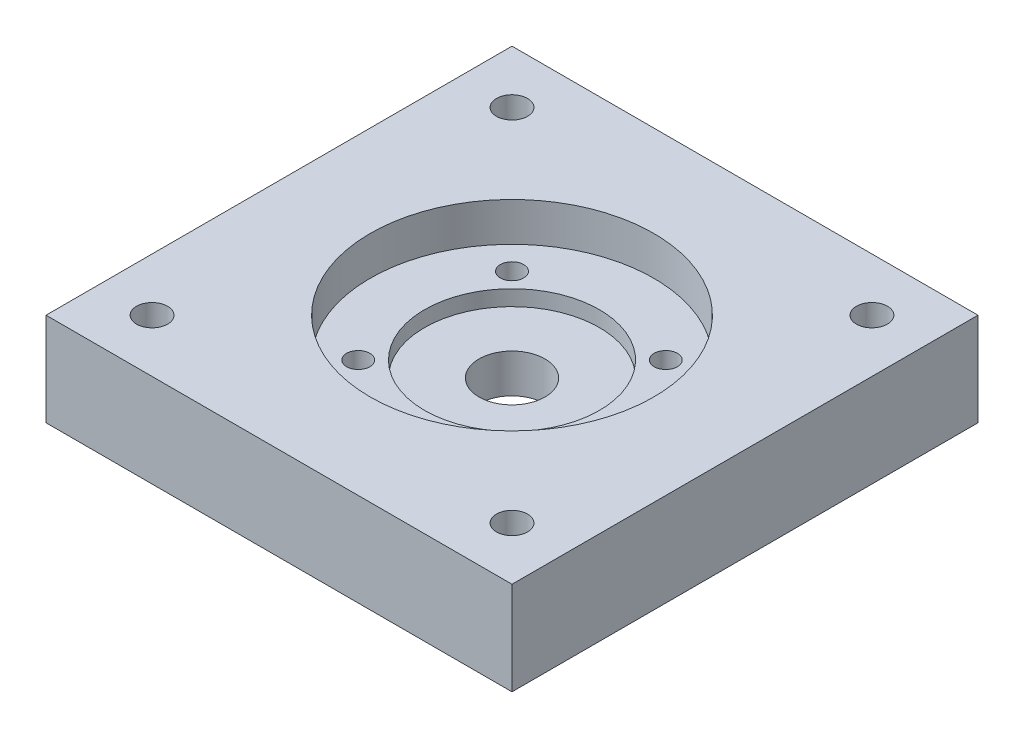
ISO-10303-21;
HEADER;
FILE_DESCRIPTION(('STEP AP214'),'2;1');
FILE_NAME('part.step','',(''),(''),'','','');
FILE_SCHEMA(('AUTOMOTIVE_DESIGN { 1 0 10303 214 1 1 1 1 }'));
ENDSEC;
DATA;
#1=APPLICATION_CONTEXT('core data for automotive mechanical design processes');
#2=APPLICATION_PROTOCOL_DEFINITION('international standard','automotive_design',2000,#1);
#3=PRODUCT_CONTEXT('',#1,'mechanical');
#4=PRODUCT('Part','Part','',(#3));
#5=PRODUCT_RELATED_PRODUCT_CATEGORY('part','',(#4));
#6=PRODUCT_DEFINITION_FORMATION('','',#4);
#7=PRODUCT_DEFINITION_CONTEXT('part definition',#1,'design');
#8=PRODUCT_DEFINITION('design','',#6,#7);
#9=PRODUCT_DEFINITION_SHAPE('','',#8);
#10=(LENGTH_UNIT() NAMED_UNIT(*) SI_UNIT(.MILLI.,.METRE.));
#11=(NAMED_UNIT(*) PLANE_ANGLE_UNIT() SI_UNIT($,.RADIAN.));
#12=(NAMED_UNIT(*) SI_UNIT($,.STERADIAN.) SOLID_ANGLE_UNIT());
#13=UNCERTAINTY_MEASURE_WITH_UNIT(LENGTH_MEASURE(1.E-05),#10,'distance_accuracy_value','');
#14=(GEOMETRIC_REPRESENTATION_CONTEXT(3) GLOBAL_UNCERTAINTY_ASSIGNED_CONTEXT((#13)) GLOBAL_UNIT_ASSIGNED_CONTEXT((#10,
#11,#12)) REPRESENTATION_CONTEXT('',''));
#15=CARTESIAN_POINT('',(0.,0.,0.));
#16=DIRECTION('',(0.,0.,1.));
#17=DIRECTION('',(1.,0.,0.));
#18=AXIS2_PLACEMENT_3D('',#15,#16,#17);
#19=CARTESIAN_POINT('',(0.,7.,0.));
#20=DIRECTION('',(0.,1.,0.));
#21=DIRECTION('',(0.,0.,1.));
#22=AXIS2_PLACEMENT_3D('',#19,#20,#21);
#23=PLANE('',#22);
#24=CARTESIAN_POINT('',(0.,7.,0.));
#25=DIRECTION('',(0.,1.,0.));
#26=DIRECTION('',(0.,0.,1.));
#27=AXIS2_PLACEMENT_3D('',#24,#25,#26);
#28=CIRCLE('',#27,11.25);
#29=CARTESIAN_POINT('',(0.,7.,11.25));
#30=VERTEX_POINT('',#29);
#31=EDGE_CURVE('E664',#30,#30,#28,.T.);
#32=ORIENTED_EDGE('',*,*,#31,.F.);
#33=EDGE_LOOP('',(#32));
#34=FACE_BOUND('',#33,.T.);
#35=CARTESIAN_POINT('',(-9.89949493661167,7.,-9.89949493661166));
#36=DIRECTION('',(0.,1.,0.));
#37=DIRECTION('',(0.,0.,1.));
#38=AXIS2_PLACEMENT_3D('',#35,#36,#37);
#39=CIRCLE('',#38,1.5);
#40=CARTESIAN_POINT('',(-9.89949493661167,7.,-8.39949493661166));
#41=VERTEX_POINT('',#40);
#42=EDGE_CURVE('E661',#41,#41,#39,.F.);
#43=ORIENTED_EDGE('',*,*,#42,.T.);
#44=EDGE_LOOP('',(#43));
#45=FACE_BOUND('',#44,.T.);
#46=CARTESIAN_POINT('',(-9.89949493661167,7.,9.89949493661166));
#47=DIRECTION('',(0.,1.,0.));
#48=DIRECTION('',(0.,0.,1.));
#49=AXIS2_PLACEMENT_3D('',#46,#47,#48);
#50=CIRCLE('',#49,1.5);
#51=CARTESIAN_POINT('',(-9.89949493661167,7.,11.3994949366117));
#52=VERTEX_POINT('',#51);
#53=EDGE_CURVE('E658',#52,#52,#50,.F.);
#54=ORIENTED_EDGE('',*,*,#53,.T.);
#55=EDGE_LOOP('',(#54));
#56=FACE_BOUND('',#55,.T.);
#57=CARTESIAN_POINT('',(9.89949493661167,7.,9.89949493661166));
#58=DIRECTION('',(0.,1.,0.));
#59=DIRECTION('',(0.,0.,1.));
#60=AXIS2_PLACEMENT_3D('',#57,#58,#59);
#61=CIRCLE('',#60,1.5);
#62=CARTESIAN_POINT('',(9.89949493661167,7.,11.3994949366117));
#63=VERTEX_POINT('',#62);
#64=EDGE_CURVE('E655',#63,#63,#61,.F.);
#65=ORIENTED_EDGE('',*,*,#64,.T.);
#66=EDGE_LOOP('',(#65));
#67=FACE_BOUND('',#66,.T.);
#68=CARTESIAN_POINT('',(9.89949493661166,7.,-9.89949493661167));
#69=DIRECTION('',(0.,1.,0.));
#70=DIRECTION('',(0.,0.,1.));
#71=AXIS2_PLACEMENT_3D('',#68,#69,#70);
#72=CIRCLE('',#71,1.5);
#73=CARTESIAN_POINT('',(9.89949493661166,7.,-8.39949493661167));
#74=VERTEX_POINT('',#73);
#75=EDGE_CURVE('E652',#74,#74,#72,.F.);
#76=ORIENTED_EDGE('',*,*,#75,.T.);
#77=EDGE_LOOP('',(#76));
#78=FACE_BOUND('',#77,.T.);
#79=CARTESIAN_POINT('',(0.,7.,0.));
#80=DIRECTION('',(0.,1.,0.));
#81=DIRECTION('',(0.,0.,1.));
#82=AXIS2_PLACEMENT_3D('',#79,#80,#81);
#83=CIRCLE('',#82,18.25);
#84=CARTESIAN_POINT('',(0.,7.,18.25));
#85=VERTEX_POINT('',#84);
#86=EDGE_CURVE('E629',#85,#85,#83,.T.);
#87=ORIENTED_EDGE('',*,*,#86,.T.);
#88=EDGE_LOOP('',(#87));
#89=FACE_BOUND('',#88,.T.);
#90=ADVANCED_FACE('F567',(#34,#45,#56,#67,#78,#89),#23,.T.);
#91=CARTESIAN_POINT('',(0.,5.,0.));
#92=DIRECTION('',(0.,1.,0.));
#93=DIRECTION('',(0.,0.,1.));
#94=AXIS2_PLACEMENT_3D('',#91,#92,#93);
#95=PLANE('',#94);
#96=CARTESIAN_POINT('',(0.,5.,0.));
#97=DIRECTION('',(0.,1.,0.));
#98=DIRECTION('',(0.,0.,1.));
#99=AXIS2_PLACEMENT_3D('',#96,#97,#98);
#100=CIRCLE('',#99,4.25);
#101=CARTESIAN_POINT('',(0.,5.,4.25));
#102=VERTEX_POINT('',#101);
#103=EDGE_CURVE('E670',#102,#102,#100,.T.);
#104=ORIENTED_EDGE('',*,*,#103,.F.);
#105=EDGE_LOOP('',(#104));
#106=FACE_BOUND('',#105,.T.);
#107=CARTESIAN_POINT('',(0.,5.,0.));
#108=DIRECTION('',(0.,1.,0.));
#109=DIRECTION('',(0.,0.,1.));
#110=AXIS2_PLACEMENT_3D('',#107,#108,#109);
#111=CIRCLE('',#110,11.25);
#112=CARTESIAN_POINT('',(0.,5.,11.25));
#113=VERTEX_POINT('',#112);
#114=EDGE_CURVE('E639',#113,#113,#111,.T.);
#115=ORIENTED_EDGE('',*,*,#114,.T.);
#116=EDGE_LOOP('',(#115));
#117=FACE_BOUND('',#116,.T.);
#118=ADVANCED_FACE('F713',(#106,#117),#95,.T.);
#119=CARTESIAN_POINT('',(30.,5.,0.));
#120=DIRECTION('',(1.,0.,0.));
#121=DIRECTION('',(0.,0.,-1.));
#122=AXIS2_PLACEMENT_3D('',#119,#120,#121);
#123=PLANE('',#122);
#124=DIRECTION('',(0.,0.,1.));
#125=VECTOR('',#124,1.);
#126=CARTESIAN_POINT('',(30.,0.,0.));
#127=LINE('',#126,#125);
#128=CARTESIAN_POINT('',(30.,0.,-30.));
#129=VERTEX_POINT('',#128);
#130=CARTESIAN_POINT('',(30.,0.,30.));
#131=VERTEX_POINT('',#130);
#132=EDGE_CURVE('E682',#129,#131,#127,.T.);
#133=ORIENTED_EDGE('',*,*,#132,.F.);
#134=DIRECTION('',(0.,-1.,0.));
#135=VECTOR('',#134,1.);
#136=CARTESIAN_POINT('',(30.,5.,-30.));
#137=LINE('',#136,#135);
#138=CARTESIAN_POINT('',(30.,12.,-30.));
#139=VERTEX_POINT('',#138);
#140=EDGE_CURVE('E12',#139,#129,#137,.T.);
#141=ORIENTED_EDGE('',*,*,#140,.F.);
#142=DIRECTION('',(0.,0.,-1.));
#143=VECTOR('',#142,1.);
#144=CARTESIAN_POINT('',(30.,12.,0.));
#145=LINE('',#144,#143);
#146=CARTESIAN_POINT('',(30.,12.,30.));
#147=VERTEX_POINT('',#146);
#148=EDGE_CURVE('E622',#147,#139,#145,.T.);
#149=ORIENTED_EDGE('',*,*,#148,.F.);
#150=DIRECTION('',(0.,-1.,0.));
#151=VECTOR('',#150,1.);
#152=CARTESIAN_POINT('',(30.,5.,30.));
#153=LINE('',#152,#151);
#154=EDGE_CURVE('E582',#147,#131,#153,.T.);
#155=ORIENTED_EDGE('',*,*,#154,.T.);
#156=EDGE_LOOP('',(#133,#141,#149,#155));
#157=FACE_BOUND('',#156,.T.);
#158=ADVANCED_FACE('F711',(#157),#123,.T.);
#159=CARTESIAN_POINT('',(0.,5.,-30.));
#160=DIRECTION('',(0.,0.,-1.));
#161=DIRECTION('',(-1.,0.,0.));
#162=AXIS2_PLACEMENT_3D('',#159,#160,#161);
#163=PLANE('',#162);
#164=DIRECTION('',(1.,0.,0.));
#165=VECTOR('',#164,1.);
#166=CARTESIAN_POINT('',(0.,0.,-30.));
#167=LINE('',#166,#165);
#168=CARTESIAN_POINT('',(-30.,0.,-30.));
#169=VERTEX_POINT('',#168);
#170=EDGE_CURVE('E684',#169,#129,#167,.T.);
#171=ORIENTED_EDGE('',*,*,#170,.F.);
#172=DIRECTION('',(0.,-1.,0.));
#173=VECTOR('',#172,1.);
#174=CARTESIAN_POINT('',(-30.,5.,-30.));
#175=LINE('',#174,#173);
#176=CARTESIAN_POINT('',(-30.,12.,-30.));
#177=VERTEX_POINT('',#176);
#178=EDGE_CURVE('E575',#177,#169,#175,.T.);
#179=ORIENTED_EDGE('',*,*,#178,.F.);
#180=DIRECTION('',(-1.,0.,0.));
#181=VECTOR('',#180,1.);
#182=CARTESIAN_POINT('',(0.,12.,-30.));
#183=LINE('',#182,#181);
#184=EDGE_CURVE('E628',#139,#177,#183,.T.);
#185=ORIENTED_EDGE('',*,*,#184,.F.);
#186=ORIENTED_EDGE('',*,*,#140,.T.);
#187=EDGE_LOOP('',(#171,#179,#185,#186));
#188=FACE_BOUND('',#187,.T.);
#189=ADVANCED_FACE('F710',(#188),#163,.T.);
#190=CARTESIAN_POINT('',(-30.,5.,0.));
#191=DIRECTION('',(1.,0.,0.));
#192=DIRECTION('',(0.,0.,-1.));
#193=AXIS2_PLACEMENT_3D('',#190,#191,#192);
#194=PLANE('',#193);
#195=DIRECTION('',(0.,0.,1.));
#196=VECTOR('',#195,1.);
#197=CARTESIAN_POINT('',(-30.,0.,0.));
#198=LINE('',#197,#196);
#199=CARTESIAN_POINT('',(-30.,0.,30.));
#200=VERTEX_POINT('',#199);
#201=EDGE_CURVE('E614',#169,#200,#198,.T.);
#202=ORIENTED_EDGE('',*,*,#201,.T.);
#203=DIRECTION('',(0.,-1.,0.));
#204=VECTOR('',#203,1.);
#205=CARTESIAN_POINT('',(-30.,5.,30.));
#206=LINE('',#205,#204);
#207=CARTESIAN_POINT('',(-30.,12.,30.));
#208=VERTEX_POINT('',#207);
#209=EDGE_CURVE('E609',#208,#200,#206,.T.);
#210=ORIENTED_EDGE('',*,*,#209,.F.);
#211=DIRECTION('',(0.,0.,1.));
#212=VECTOR('',#211,1.);
#213=CARTESIAN_POINT('',(-30.,12.,0.));
#214=LINE('',#213,#212);
#215=EDGE_CURVE('E613',#177,#208,#214,.T.);
#216=ORIENTED_EDGE('',*,*,#215,.F.);
#217=ORIENTED_EDGE('',*,*,#178,.T.);
#218=EDGE_LOOP('',(#202,#210,#216,#217));
#219=FACE_BOUND('',#218,.T.);
#220=ADVANCED_FACE('F611',(#219),#194,.F.);
#221=CARTESIAN_POINT('',(9.89949493661167,5.,9.89949493661166));
#222=DIRECTION('',(0.,-1.,0.));
#223=DIRECTION('',(0.,0.,-1.));
#224=AXIS2_PLACEMENT_3D('',#221,#222,#223);
#225=CYLINDRICAL_SURFACE('',#224,1.5);
#226=CARTESIAN_POINT('',(9.89949493661167,0.,9.89949493661166));
#227=DIRECTION('',(0.,1.,0.));
#228=DIRECTION('',(0.,0.,1.));
#229=AXIS2_PLACEMENT_3D('',#226,#227,#228);
#230=CIRCLE('',#229,1.5);
#231=CARTESIAN_POINT('',(9.89949493661167,0.,11.3994949366117));
#232=VERTEX_POINT('',#231);
#233=EDGE_CURVE('E701',#232,#232,#230,.T.);
#234=ORIENTED_EDGE('',*,*,#233,.F.);
#235=EDGE_LOOP('',(#234));
#236=FACE_BOUND('',#235,.T.);
#237=ORIENTED_EDGE('',*,*,#64,.F.);
#238=EDGE_LOOP('',(#237));
#239=FACE_BOUND('',#238,.T.);
#240=ADVANCED_FACE('F745',(#236,#239),#225,.F.);
#241=CARTESIAN_POINT('',(-23.1713203435596,5.,-23.1713203435596));
#242=DIRECTION('',(0.,-1.,0.));
#243=DIRECTION('',(0.,0.,-1.));
#244=AXIS2_PLACEMENT_3D('',#241,#242,#243);
#245=CYLINDRICAL_SURFACE('',#244,2.00000000000001);
#246=CARTESIAN_POINT('',(-23.1713203435596,0.,-23.1713203435596));
#247=DIRECTION('',(0.,1.,0.));
#248=DIRECTION('',(0.,0.,1.));
#249=AXIS2_PLACEMENT_3D('',#246,#247,#248);
#250=CIRCLE('',#249,2.00000000000001);
#251=CARTESIAN_POINT('',(-23.1713203435596,0.,-21.1713203435596));
#252=VERTEX_POINT('',#251);
#253=EDGE_CURVE('E698',#252,#252,#250,.T.);
#254=ORIENTED_EDGE('',*,*,#253,.F.);
#255=EDGE_LOOP('',(#254));
#256=FACE_BOUND('',#255,.T.);
#257=CARTESIAN_POINT('',(-23.1713203435596,12.,-23.1713203435596));
#258=DIRECTION('',(0.,1.,0.));
#259=DIRECTION('',(0.,0.,1.));
#260=AXIS2_PLACEMENT_3D('',#257,#258,#259);
#261=CIRCLE('',#260,2.00000000000001);
#262=CARTESIAN_POINT('',(-23.1713203435596,12.,-21.1713203435596));
#263=VERTEX_POINT('',#262);
#264=EDGE_CURVE('E646',#263,#263,#261,.T.);
#265=ORIENTED_EDGE('',*,*,#264,.T.);
#266=EDGE_LOOP('',(#265));
#267=FACE_BOUND('',#266,.T.);
#268=ADVANCED_FACE('F748',(#256,#267),#245,.F.);
#269=CARTESIAN_POINT('',(23.1713203435596,5.,-23.1713203435596));
#270=DIRECTION('',(0.,-1.,0.));
#271=DIRECTION('',(0.,0.,-1.));
#272=AXIS2_PLACEMENT_3D('',#269,#270,#271);
#273=CYLINDRICAL_SURFACE('',#272,2.);
#274=CARTESIAN_POINT('',(23.1713203435596,0.,-23.1713203435596));
#275=DIRECTION('',(0.,1.,0.));
#276=DIRECTION('',(0.,0.,1.));
#277=AXIS2_PLACEMENT_3D('',#274,#275,#276);
#278=CIRCLE('',#277,2.);
#279=CARTESIAN_POINT('',(23.1713203435596,0.,-21.1713203435596));
#280=VERTEX_POINT('',#279);
#281=EDGE_CURVE('E695',#280,#280,#278,.T.);
#282=ORIENTED_EDGE('',*,*,#281,.F.);
#283=EDGE_LOOP('',(#282));
#284=FACE_BOUND('',#283,.T.);
#285=CARTESIAN_POINT('',(23.1713203435596,12.,-23.1713203435596));
#286=DIRECTION('',(0.,1.,0.));
#287=DIRECTION('',(0.,0.,1.));
#288=AXIS2_PLACEMENT_3D('',#285,#286,#287);
#289=CIRCLE('',#288,2.);
#290=CARTESIAN_POINT('',(23.1713203435596,12.,-21.1713203435596));
#291=VERTEX_POINT('',#290);
#292=EDGE_CURVE('E649',#291,#291,#289,.T.);
#293=ORIENTED_EDGE('',*,*,#292,.T.);
#294=EDGE_LOOP('',(#293));
#295=FACE_BOUND('',#294,.T.);
#296=ADVANCED_FACE('F752',(#284,#295),#273,.F.);
#297=CARTESIAN_POINT('',(23.1713203435597,5.,23.1713203435597));
#298=DIRECTION('',(0.,-1.,0.));
#299=DIRECTION('',(0.,0.,-1.));
#300=AXIS2_PLACEMENT_3D('',#297,#298,#299);
#301=CYLINDRICAL_SURFACE('',#300,2.00000000000001);
#302=CARTESIAN_POINT('',(23.1713203435597,0.,23.1713203435597));
#303=DIRECTION('',(0.,1.,0.));
#304=DIRECTION('',(0.,0.,1.));
#305=AXIS2_PLACEMENT_3D('',#302,#303,#304);
#306=CIRCLE('',#305,2.00000000000001);
#307=CARTESIAN_POINT('',(23.1713203435597,0.,25.1713203435597));
#308=VERTEX_POINT('',#307);
#309=EDGE_CURVE('E692',#308,#308,#306,.T.);
#310=ORIENTED_EDGE('',*,*,#309,.F.);
#311=EDGE_LOOP('',(#310));
#312=FACE_BOUND('',#311,.T.);
#313=CARTESIAN_POINT('',(23.1713203435597,12.,23.1713203435597));
#314=DIRECTION('',(0.,1.,0.));
#315=DIRECTION('',(0.,0.,1.));
#316=AXIS2_PLACEMENT_3D('',#313,#314,#315);
#317=CIRCLE('',#316,2.00000000000001);
#318=CARTESIAN_POINT('',(23.1713203435597,12.,25.1713203435597));
#319=VERTEX_POINT('',#318);
#320=EDGE_CURVE('E632',#319,#319,#317,.T.);
#321=ORIENTED_EDGE('',*,*,#320,.T.);
#322=EDGE_LOOP('',(#321));
#323=FACE_BOUND('',#322,.T.);
#324=ADVANCED_FACE('F756',(#312,#323),#301,.F.);
#325=CARTESIAN_POINT('',(-23.1713203435596,5.,23.1713203435597));
#326=DIRECTION('',(0.,-1.,0.));
#327=DIRECTION('',(0.,0.,-1.));
#328=AXIS2_PLACEMENT_3D('',#325,#326,#327);
#329=CYLINDRICAL_SURFACE('',#328,2.00000000000001);
#330=CARTESIAN_POINT('',(-23.1713203435596,0.,23.1713203435597));
#331=DIRECTION('',(0.,1.,0.));
#332=DIRECTION('',(0.,0.,1.));
#333=AXIS2_PLACEMENT_3D('',#330,#331,#332);
#334=CIRCLE('',#333,2.00000000000001);
#335=CARTESIAN_POINT('',(-23.1713203435596,0.,25.1713203435597));
#336=VERTEX_POINT('',#335);
#337=EDGE_CURVE('E689',#336,#336,#334,.T.);
#338=ORIENTED_EDGE('',*,*,#337,.F.);
#339=EDGE_LOOP('',(#338));
#340=FACE_BOUND('',#339,.T.);
#341=CARTESIAN_POINT('',(-23.1713203435596,12.,23.1713203435597));
#342=DIRECTION('',(0.,1.,0.));
#343=DIRECTION('',(0.,0.,1.));
#344=AXIS2_PLACEMENT_3D('',#341,#342,#343);
#345=CIRCLE('',#344,2.00000000000001);
#346=CARTESIAN_POINT('',(-23.1713203435596,12.,25.1713203435597));
#347=VERTEX_POINT('',#346);
#348=EDGE_CURVE('E643',#347,#347,#345,.T.);
#349=ORIENTED_EDGE('',*,*,#348,.T.);
#350=EDGE_LOOP('',(#349));
#351=FACE_BOUND('',#350,.T.);
#352=ADVANCED_FACE('F760',(#340,#351),#329,.F.);
#353=CARTESIAN_POINT('',(0.,5.,30.));
#354=DIRECTION('',(0.,0.,-1.));
#355=DIRECTION('',(-1.,0.,0.));
#356=AXIS2_PLACEMENT_3D('',#353,#354,#355);
#357=PLANE('',#356);
#358=DIRECTION('',(1.,0.,0.));
#359=VECTOR('',#358,1.);
#360=CARTESIAN_POINT('',(0.,0.,30.));
#361=LINE('',#360,#359);
#362=EDGE_CURVE('E589',#200,#131,#361,.T.);
#363=ORIENTED_EDGE('',*,*,#362,.T.);
#364=ORIENTED_EDGE('',*,*,#154,.F.);
#365=DIRECTION('',(1.,0.,0.));
#366=VECTOR('',#365,1.);
#367=CARTESIAN_POINT('',(0.,12.,30.));
#368=LINE('',#367,#366);
#369=EDGE_CURVE('E618',#208,#147,#368,.T.);
#370=ORIENTED_EDGE('',*,*,#369,.F.);
#371=ORIENTED_EDGE('',*,*,#209,.T.);
#372=EDGE_LOOP('',(#363,#364,#370,#371));
#373=FACE_BOUND('',#372,.T.);
#374=ADVANCED_FACE('F619',(#373),#357,.F.);
#375=CARTESIAN_POINT('',(9.89949493661166,5.,-9.89949493661167));
#376=DIRECTION('',(0.,-1.,0.));
#377=DIRECTION('',(0.,0.,-1.));
#378=AXIS2_PLACEMENT_3D('',#375,#376,#377);
#379=CYLINDRICAL_SURFACE('',#378,1.5);
#380=CARTESIAN_POINT('',(9.89949493661166,0.,-9.89949493661167));
#381=DIRECTION('',(0.,1.,0.));
#382=DIRECTION('',(0.,0.,1.));
#383=AXIS2_PLACEMENT_3D('',#380,#381,#382);
#384=CIRCLE('',#383,1.5);
#385=CARTESIAN_POINT('',(9.89949493661166,0.,-8.39949493661167));
#386=VERTEX_POINT('',#385);
#387=EDGE_CURVE('E679',#386,#386,#384,.T.);
#388=ORIENTED_EDGE('',*,*,#387,.F.);
#389=EDGE_LOOP('',(#388));
#390=FACE_BOUND('',#389,.T.);
#391=ORIENTED_EDGE('',*,*,#75,.F.);
#392=EDGE_LOOP('',(#391));
#393=FACE_BOUND('',#392,.T.);
#394=ADVANCED_FACE('F767',(#390,#393),#379,.F.);
#395=CARTESIAN_POINT('',(-9.89949493661167,5.,-9.89949493661166));
#396=DIRECTION('',(0.,-1.,0.));
#397=DIRECTION('',(0.,0.,-1.));
#398=AXIS2_PLACEMENT_3D('',#395,#396,#397);
#399=CYLINDRICAL_SURFACE('',#398,1.5);
#400=CARTESIAN_POINT('',(-9.89949493661167,0.,-9.89949493661166));
#401=DIRECTION('',(0.,1.,0.));
#402=DIRECTION('',(0.,0.,1.));
#403=AXIS2_PLACEMENT_3D('',#400,#401,#402);
#404=CIRCLE('',#403,1.5);
#405=CARTESIAN_POINT('',(-9.89949493661167,0.,-8.39949493661166));
#406=VERTEX_POINT('',#405);
#407=EDGE_CURVE('E676',#406,#406,#404,.T.);
#408=ORIENTED_EDGE('',*,*,#407,.F.);
#409=EDGE_LOOP('',(#408));
#410=FACE_BOUND('',#409,.T.);
#411=ORIENTED_EDGE('',*,*,#42,.F.);
#412=EDGE_LOOP('',(#411));
#413=FACE_BOUND('',#412,.T.);
#414=ADVANCED_FACE('F805',(#410,#413),#399,.F.);
#415=CARTESIAN_POINT('',(-9.89949493661167,5.,9.89949493661166));
#416=DIRECTION('',(0.,-1.,0.));
#417=DIRECTION('',(0.,0.,-1.));
#418=AXIS2_PLACEMENT_3D('',#415,#416,#417);
#419=CYLINDRICAL_SURFACE('',#418,1.5);
#420=CARTESIAN_POINT('',(-9.89949493661167,0.,9.89949493661166));
#421=DIRECTION('',(0.,1.,0.));
#422=DIRECTION('',(0.,0.,1.));
#423=AXIS2_PLACEMENT_3D('',#420,#421,#422);
#424=CIRCLE('',#423,1.5);
#425=CARTESIAN_POINT('',(-9.89949493661167,0.,11.3994949366117));
#426=VERTEX_POINT('',#425);
#427=EDGE_CURVE('E667',#426,#426,#424,.T.);
#428=ORIENTED_EDGE('',*,*,#427,.F.);
#429=EDGE_LOOP('',(#428));
#430=FACE_BOUND('',#429,.T.);
#431=ORIENTED_EDGE('',*,*,#53,.F.);
#432=EDGE_LOOP('',(#431));
#433=FACE_BOUND('',#432,.T.);
#434=ADVANCED_FACE('F569',(#430,#433),#419,.F.);
#435=CARTESIAN_POINT('',(0.,5.,0.));
#436=DIRECTION('',(0.,-1.,0.));
#437=DIRECTION('',(0.,0.,-1.));
#438=AXIS2_PLACEMENT_3D('',#435,#436,#437);
#439=CYLINDRICAL_SURFACE('',#438,4.25);
#440=ORIENTED_EDGE('',*,*,#103,.T.);
#441=EDGE_LOOP('',(#440));
#442=FACE_BOUND('',#441,.T.);
#443=CARTESIAN_POINT('',(0.,0.,0.));
#444=DIRECTION('',(0.,1.,0.));
#445=DIRECTION('',(0.,0.,1.));
#446=AXIS2_PLACEMENT_3D('',#443,#444,#445);
#447=CIRCLE('',#446,4.25);
#448=CARTESIAN_POINT('',(0.,0.,4.25));
#449=VERTEX_POINT('',#448);
#450=EDGE_CURVE('E673',#449,#449,#447,.T.);
#451=ORIENTED_EDGE('',*,*,#450,.F.);
#452=EDGE_LOOP('',(#451));
#453=FACE_BOUND('',#452,.T.);
#454=ADVANCED_FACE('F740',(#442,#453),#439,.F.);
#455=CARTESIAN_POINT('',(0.,0.,0.));
#456=DIRECTION('',(0.,1.,0.));
#457=DIRECTION('',(0.,0.,1.));
#458=AXIS2_PLACEMENT_3D('',#455,#456,#457);
#459=PLANE('',#458);
#460=ORIENTED_EDGE('',*,*,#427,.T.);
#461=EDGE_LOOP('',(#460));
#462=FACE_BOUND('',#461,.T.);
#463=ORIENTED_EDGE('',*,*,#407,.T.);
#464=EDGE_LOOP('',(#463));
#465=FACE_BOUND('',#464,.T.);
#466=ORIENTED_EDGE('',*,*,#387,.T.);
#467=EDGE_LOOP('',(#466));
#468=FACE_BOUND('',#467,.T.);
#469=ORIENTED_EDGE('',*,*,#132,.T.);
#470=ORIENTED_EDGE('',*,*,#362,.F.);
#471=ORIENTED_EDGE('',*,*,#201,.F.);
#472=ORIENTED_EDGE('',*,*,#170,.T.);
#473=EDGE_LOOP('',(#469,#470,#471,#472));
#474=FACE_BOUND('',#473,.T.);
#475=ORIENTED_EDGE('',*,*,#337,.T.);
#476=EDGE_LOOP('',(#475));
#477=FACE_BOUND('',#476,.T.);
#478=ORIENTED_EDGE('',*,*,#309,.T.);
#479=EDGE_LOOP('',(#478));
#480=FACE_BOUND('',#479,.T.);
#481=ORIENTED_EDGE('',*,*,#281,.T.);
#482=EDGE_LOOP('',(#481));
#483=FACE_BOUND('',#482,.T.);
#484=ORIENTED_EDGE('',*,*,#253,.T.);
#485=EDGE_LOOP('',(#484));
#486=FACE_BOUND('',#485,.T.);
#487=ORIENTED_EDGE('',*,*,#233,.T.);
#488=EDGE_LOOP('',(#487));
#489=FACE_BOUND('',#488,.T.);
#490=ORIENTED_EDGE('',*,*,#450,.T.);
#491=EDGE_LOOP('',(#490));
#492=FACE_BOUND('',#491,.T.);
#493=ADVANCED_FACE('F708',(#462,#465,#468,#474,#477,#480,#483,#486,#489,#492),#459,.F.);
#494=CARTESIAN_POINT('',(0.,7.,0.));
#495=DIRECTION('',(0.,-1.,0.));
#496=DIRECTION('',(0.,0.,-1.));
#497=AXIS2_PLACEMENT_3D('',#494,#495,#496);
#498=CYLINDRICAL_SURFACE('',#497,11.25);
#499=ORIENTED_EDGE('',*,*,#31,.T.);
#500=EDGE_LOOP('',(#499));
#501=FACE_BOUND('',#500,.T.);
#502=ORIENTED_EDGE('',*,*,#114,.F.);
#503=EDGE_LOOP('',(#502));
#504=FACE_BOUND('',#503,.T.);
#505=ADVANCED_FACE('F734',(#501,#504),#498,.F.);
#506=CARTESIAN_POINT('',(0.,12.,0.));
#507=DIRECTION('',(0.,-1.,0.));
#508=DIRECTION('',(0.,0.,-1.));
#509=AXIS2_PLACEMENT_3D('',#506,#507,#508);
#510=CYLINDRICAL_SURFACE('',#509,18.25);
#511=CARTESIAN_POINT('',(0.,12.,0.));
#512=DIRECTION('',(0.,1.,0.));
#513=DIRECTION('',(0.,0.,1.));
#514=AXIS2_PLACEMENT_3D('',#511,#512,#513);
#515=CIRCLE('',#514,18.25);
#516=CARTESIAN_POINT('',(0.,12.,18.25));
#517=VERTEX_POINT('',#516);
#518=EDGE_CURVE('E637',#517,#517,#515,.T.);
#519=ORIENTED_EDGE('',*,*,#518,.T.);
#520=EDGE_LOOP('',(#519));
#521=FACE_BOUND('',#520,.T.);
#522=ORIENTED_EDGE('',*,*,#86,.F.);
#523=EDGE_LOOP('',(#522));
#524=FACE_BOUND('',#523,.T.);
#525=ADVANCED_FACE('F732',(#521,#524),#510,.F.);
#526=CARTESIAN_POINT('',(0.,12.,0.));
#527=DIRECTION('',(0.,1.,0.));
#528=DIRECTION('',(0.,0.,1.));
#529=AXIS2_PLACEMENT_3D('',#526,#527,#528);
#530=PLANE('',#529);
#531=ORIENTED_EDGE('',*,*,#215,.T.);
#532=ORIENTED_EDGE('',*,*,#369,.T.);
#533=ORIENTED_EDGE('',*,*,#148,.T.);
#534=ORIENTED_EDGE('',*,*,#184,.T.);
#535=EDGE_LOOP('',(#531,#532,#533,#534));
#536=FACE_BOUND('',#535,.T.);
#537=ORIENTED_EDGE('',*,*,#518,.F.);
#538=EDGE_LOOP('',(#537));
#539=FACE_BOUND('',#538,.T.);
#540=ORIENTED_EDGE('',*,*,#292,.F.);
#541=EDGE_LOOP('',(#540));
#542=FACE_BOUND('',#541,.T.);
#543=ORIENTED_EDGE('',*,*,#264,.F.);
#544=EDGE_LOOP('',(#543));
#545=FACE_BOUND('',#544,.T.);
#546=ORIENTED_EDGE('',*,*,#348,.F.);
#547=EDGE_LOOP('',(#546));
#548=FACE_BOUND('',#547,.T.);
#549=ORIENTED_EDGE('',*,*,#320,.F.);
#550=EDGE_LOOP('',(#549));
#551=FACE_BOUND('',#550,.T.);
#552=ADVANCED_FACE('F625',(#536,#539,#542,#545,#548,#551),#530,.T.);
#553=CLOSED_SHELL('',(#90,#118,#158,#189,#220,#240,#268,#296,#324,#352,#374,#394,#414,#434,#454,
#493,#505,#525,#552));
#554=MANIFOLD_SOLID_BREP('B2',#553);
#555=ADVANCED_BREP_SHAPE_REPRESENTATION('',(#18,#554),#14);
#556=SHAPE_DEFINITION_REPRESENTATION(#9,#555);
ENDSEC;
END-ISO-10303-21;
